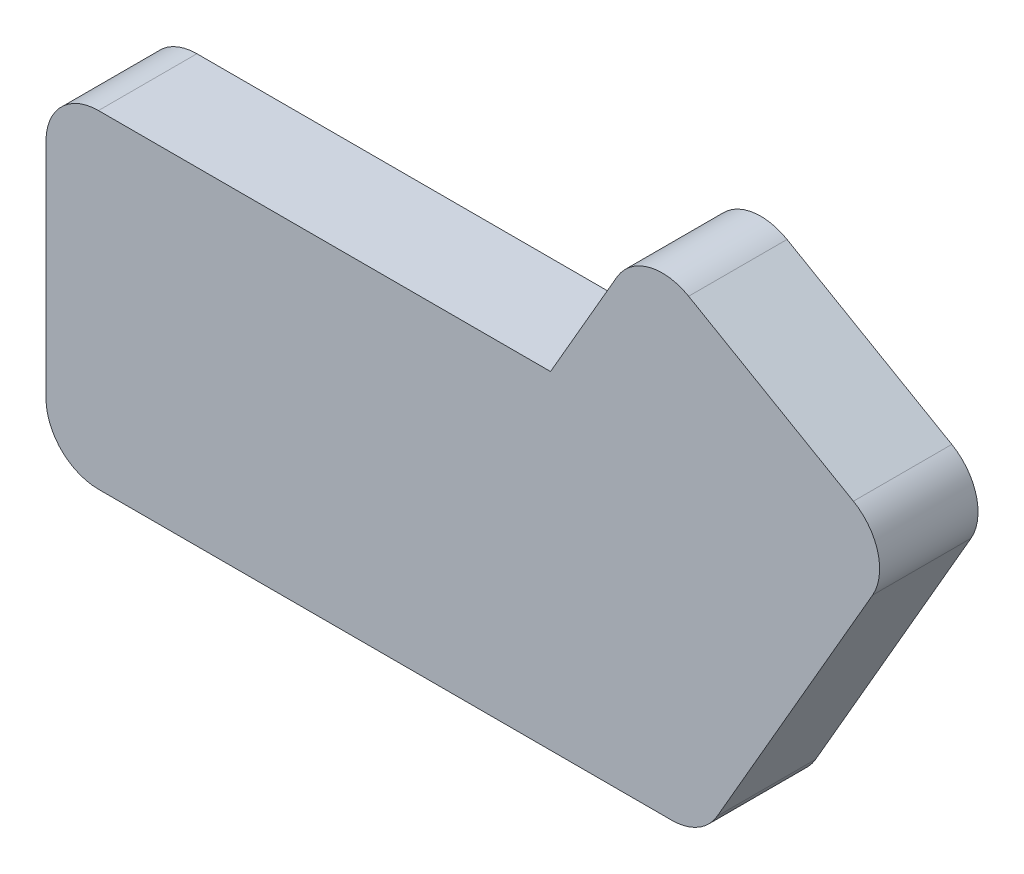
ISO-10303-21;
HEADER;
FILE_DESCRIPTION(('STEP AP214'),'2;1');
FILE_NAME('part.step','',(''),(''),'','','');
FILE_SCHEMA(('AUTOMOTIVE_DESIGN { 1 0 10303 214 1 1 1 1 }'));
ENDSEC;
DATA;
#1=APPLICATION_CONTEXT('core data for automotive mechanical design processes');
#2=APPLICATION_PROTOCOL_DEFINITION('international standard','automotive_design',2000,#1);
#3=PRODUCT_CONTEXT('',#1,'mechanical');
#4=PRODUCT('Part','Part','',(#3));
#5=PRODUCT_RELATED_PRODUCT_CATEGORY('part','',(#4));
#6=PRODUCT_DEFINITION_FORMATION('','',#4);
#7=PRODUCT_DEFINITION_CONTEXT('part definition',#1,'design');
#8=PRODUCT_DEFINITION('design','',#6,#7);
#9=PRODUCT_DEFINITION_SHAPE('','',#8);
#10=(LENGTH_UNIT() NAMED_UNIT(*) SI_UNIT(.MILLI.,.METRE.));
#11=(NAMED_UNIT(*) PLANE_ANGLE_UNIT() SI_UNIT($,.RADIAN.));
#12=(NAMED_UNIT(*) SI_UNIT($,.STERADIAN.) SOLID_ANGLE_UNIT());
#13=UNCERTAINTY_MEASURE_WITH_UNIT(LENGTH_MEASURE(1.E-05),#10,'distance_accuracy_value','');
#14=(GEOMETRIC_REPRESENTATION_CONTEXT(3) GLOBAL_UNCERTAINTY_ASSIGNED_CONTEXT((#13)) GLOBAL_UNIT_ASSIGNED_CONTEXT((#10,
#11,#12)) REPRESENTATION_CONTEXT('',''));
#15=CARTESIAN_POINT('',(0.,0.,0.));
#16=DIRECTION('',(0.,0.,1.));
#17=DIRECTION('',(1.,0.,0.));
#18=AXIS2_PLACEMENT_3D('',#15,#16,#17);
#19=CARTESIAN_POINT('',(76.9059892324149,50.,15.));
#20=DIRECTION('',(0.,-1.,0.));
#21=DIRECTION('',(1.,0.,0.));
#22=AXIS2_PLACEMENT_3D('',#19,#20,#21);
#23=PLANE('',#22);
#24=DIRECTION('',(-1.,0.,0.));
#25=VECTOR('',#24,1.);
#26=CARTESIAN_POINT('',(76.9059892324149,50.,0.));
#27=LINE('',#26,#25);
#28=CARTESIAN_POINT('',(76.9059892324149,50.,0.));
#29=VERTEX_POINT('',#28);
#30=CARTESIAN_POINT('',(8.00000000000006,50.,0.));
#31=VERTEX_POINT('',#30);
#32=EDGE_CURVE('E158',#29,#31,#27,.T.);
#33=ORIENTED_EDGE('',*,*,#32,.T.);
#34=DIRECTION('',(0.,0.,-1.));
#35=VECTOR('',#34,1.);
#36=CARTESIAN_POINT('',(8.00000000000006,50.,15.));
#37=LINE('',#36,#35);
#38=CARTESIAN_POINT('',(8.00000000000006,50.,15.));
#39=VERTEX_POINT('',#38);
#40=EDGE_CURVE('E11',#39,#31,#37,.T.);
#41=ORIENTED_EDGE('',*,*,#40,.F.);
#42=DIRECTION('',(-1.,0.,0.));
#43=VECTOR('',#42,1.);
#44=CARTESIAN_POINT('',(76.9059892324149,50.,15.));
#45=LINE('',#44,#43);
#46=CARTESIAN_POINT('',(76.9059892324149,50.,15.));
#47=VERTEX_POINT('',#46);
#48=EDGE_CURVE('E189',#47,#39,#45,.T.);
#49=ORIENTED_EDGE('',*,*,#48,.F.);
#50=DIRECTION('',(0.,0.,-1.));
#51=VECTOR('',#50,1.);
#52=CARTESIAN_POINT('',(76.9059892324149,50.,15.));
#53=LINE('',#52,#51);
#54=EDGE_CURVE('E154',#47,#29,#53,.T.);
#55=ORIENTED_EDGE('',*,*,#54,.T.);
#56=EDGE_LOOP('',(#33,#41,#49,#55));
#57=FACE_BOUND('',#56,.T.);
#58=ADVANCED_FACE('F39',(#57),#23,.F.);
#59=CARTESIAN_POINT('',(8.,42.,15.));
#60=DIRECTION('',(0.,0.,-1.));
#61=DIRECTION('',(-1.,0.,0.));
#62=AXIS2_PLACEMENT_3D('',#59,#60,#61);
#63=CYLINDRICAL_SURFACE('',#62,8.);
#64=CARTESIAN_POINT('',(8.,42.,0.));
#65=DIRECTION('',(0.,0.,1.));
#66=DIRECTION('',(1.,0.,0.));
#67=AXIS2_PLACEMENT_3D('',#64,#65,#66);
#68=CIRCLE('',#67,8.);
#69=CARTESIAN_POINT('',(0.,42.,0.));
#70=VERTEX_POINT('',#69);
#71=EDGE_CURVE('E162',#31,#70,#68,.T.);
#72=ORIENTED_EDGE('',*,*,#71,.T.);
#73=DIRECTION('',(0.,0.,-1.));
#74=VECTOR('',#73,1.);
#75=CARTESIAN_POINT('',(0.,42.,15.));
#76=LINE('',#75,#74);
#77=CARTESIAN_POINT('',(0.,42.,15.));
#78=VERTEX_POINT('',#77);
#79=EDGE_CURVE('E48',#78,#70,#76,.T.);
#80=ORIENTED_EDGE('',*,*,#79,.F.);
#81=CARTESIAN_POINT('',(8.,42.,15.));
#82=DIRECTION('',(0.,0.,1.));
#83=DIRECTION('',(1.,0.,0.));
#84=AXIS2_PLACEMENT_3D('',#81,#82,#83);
#85=CIRCLE('',#84,8.);
#86=EDGE_CURVE('E108',#39,#78,#85,.T.);
#87=ORIENTED_EDGE('',*,*,#86,.F.);
#88=ORIENTED_EDGE('',*,*,#40,.T.);
#89=EDGE_LOOP('',(#72,#80,#87,#88));
#90=FACE_BOUND('',#89,.T.);
#91=ADVANCED_FACE('F275',(#90),#63,.T.);
#92=CARTESIAN_POINT('',(0.,42.,15.));
#93=DIRECTION('',(1.,0.,0.));
#94=DIRECTION('',(0.,1.,0.));
#95=AXIS2_PLACEMENT_3D('',#92,#93,#94);
#96=PLANE('',#95);
#97=DIRECTION('',(0.,-1.,0.));
#98=VECTOR('',#97,1.);
#99=CARTESIAN_POINT('',(0.,42.,0.));
#100=LINE('',#99,#98);
#101=CARTESIAN_POINT('',(0.,8.00000000000006,0.));
#102=VERTEX_POINT('',#101);
#103=EDGE_CURVE('E165',#70,#102,#100,.T.);
#104=ORIENTED_EDGE('',*,*,#103,.T.);
#105=DIRECTION('',(0.,0.,-1.));
#106=VECTOR('',#105,1.);
#107=CARTESIAN_POINT('',(0.,8.00000000000006,15.));
#108=LINE('',#107,#106);
#109=CARTESIAN_POINT('',(0.,8.00000000000006,15.));
#110=VERTEX_POINT('',#109);
#111=EDGE_CURVE('E212',#110,#102,#108,.T.);
#112=ORIENTED_EDGE('',*,*,#111,.F.);
#113=DIRECTION('',(0.,-1.,0.));
#114=VECTOR('',#113,1.);
#115=CARTESIAN_POINT('',(0.,42.,15.));
#116=LINE('',#115,#114);
#117=EDGE_CURVE('E222',#78,#110,#116,.T.);
#118=ORIENTED_EDGE('',*,*,#117,.F.);
#119=ORIENTED_EDGE('',*,*,#79,.T.);
#120=EDGE_LOOP('',(#104,#112,#118,#119));
#121=FACE_BOUND('',#120,.T.);
#122=ADVANCED_FACE('F220',(#121),#96,.F.);
#123=CARTESIAN_POINT('',(8.,8.,15.));
#124=DIRECTION('',(0.,0.,-1.));
#125=DIRECTION('',(-1.,0.,0.));
#126=AXIS2_PLACEMENT_3D('',#123,#124,#125);
#127=CYLINDRICAL_SURFACE('',#126,8.);
#128=CARTESIAN_POINT('',(8.,8.,0.));
#129=DIRECTION('',(0.,0.,1.));
#130=DIRECTION('',(1.,0.,0.));
#131=AXIS2_PLACEMENT_3D('',#128,#129,#130);
#132=CIRCLE('',#131,8.);
#133=CARTESIAN_POINT('',(8.00000000000006,0.,0.));
#134=VERTEX_POINT('',#133);
#135=EDGE_CURVE('E168',#102,#134,#132,.T.);
#136=ORIENTED_EDGE('',*,*,#135,.T.);
#137=DIRECTION('',(0.,0.,-1.));
#138=VECTOR('',#137,1.);
#139=CARTESIAN_POINT('',(8.00000000000006,0.,15.));
#140=LINE('',#139,#138);
#141=CARTESIAN_POINT('',(8.00000000000006,0.,15.));
#142=VERTEX_POINT('',#141);
#143=EDGE_CURVE('E208',#142,#134,#140,.T.);
#144=ORIENTED_EDGE('',*,*,#143,.F.);
#145=CARTESIAN_POINT('',(8.,8.,15.));
#146=DIRECTION('',(0.,0.,1.));
#147=DIRECTION('',(1.,0.,0.));
#148=AXIS2_PLACEMENT_3D('',#145,#146,#147);
#149=CIRCLE('',#148,8.);
#150=EDGE_CURVE('E241',#110,#142,#149,.T.);
#151=ORIENTED_EDGE('',*,*,#150,.F.);
#152=ORIENTED_EDGE('',*,*,#111,.T.);
#153=EDGE_LOOP('',(#136,#144,#151,#152));
#154=FACE_BOUND('',#153,.T.);
#155=ADVANCED_FACE('F231',(#154),#127,.T.);
#156=CARTESIAN_POINT('',(8.00000000000006,0.,15.));
#157=DIRECTION('',(0.,1.,0.));
#158=DIRECTION('',(0.,0.,1.));
#159=AXIS2_PLACEMENT_3D('',#156,#157,#158);
#160=PLANE('',#159);
#161=DIRECTION('',(1.,0.,0.));
#162=VECTOR('',#161,1.);
#163=CARTESIAN_POINT('',(8.00000000000006,0.,0.));
#164=LINE('',#163,#162);
#165=CARTESIAN_POINT('',(95.381197846483,0.,0.));
#166=VERTEX_POINT('',#165);
#167=EDGE_CURVE('E171',#134,#166,#164,.T.);
#168=ORIENTED_EDGE('',*,*,#167,.T.);
#169=DIRECTION('',(0.,0.,-1.));
#170=VECTOR('',#169,1.);
#171=CARTESIAN_POINT('',(95.381197846483,0.,15.));
#172=LINE('',#171,#170);
#173=CARTESIAN_POINT('',(95.381197846483,0.,15.));
#174=VERTEX_POINT('',#173);
#175=EDGE_CURVE('E204',#174,#166,#172,.T.);
#176=ORIENTED_EDGE('',*,*,#175,.F.);
#177=DIRECTION('',(1.,0.,0.));
#178=VECTOR('',#177,1.);
#179=CARTESIAN_POINT('',(8.00000000000006,0.,15.));
#180=LINE('',#179,#178);
#181=EDGE_CURVE('E237',#142,#174,#180,.T.);
#182=ORIENTED_EDGE('',*,*,#181,.F.);
#183=ORIENTED_EDGE('',*,*,#143,.T.);
#184=EDGE_LOOP('',(#168,#176,#182,#183));
#185=FACE_BOUND('',#184,.T.);
#186=ADVANCED_FACE('F235',(#185),#160,.F.);
#187=CARTESIAN_POINT('',(95.381197846483,8.,15.));
#188=DIRECTION('',(0.,0.,-1.));
#189=DIRECTION('',(-1.,0.,0.));
#190=AXIS2_PLACEMENT_3D('',#187,#188,#189);
#191=CYLINDRICAL_SURFACE('',#190,8.00000000000001);
#192=CARTESIAN_POINT('',(95.381197846483,8.,0.));
#193=DIRECTION('',(0.,0.,1.));
#194=DIRECTION('',(1.,0.,0.));
#195=AXIS2_PLACEMENT_3D('',#192,#193,#194);
#196=CIRCLE('',#195,8.00000000000001);
#197=CARTESIAN_POINT('',(102.309401076759,4.00000000000001,0.));
#198=VERTEX_POINT('',#197);
#199=EDGE_CURVE('E174',#166,#198,#196,.T.);
#200=ORIENTED_EDGE('',*,*,#199,.T.);
#201=DIRECTION('',(0.,0.,-1.));
#202=VECTOR('',#201,1.);
#203=CARTESIAN_POINT('',(102.309401076759,4.00000000000001,15.));
#204=LINE('',#203,#202);
#205=CARTESIAN_POINT('',(102.309401076759,4.00000000000001,15.));
#206=VERTEX_POINT('',#205);
#207=EDGE_CURVE('E200',#206,#198,#204,.T.);
#208=ORIENTED_EDGE('',*,*,#207,.F.);
#209=CARTESIAN_POINT('',(95.381197846483,8.,15.));
#210=DIRECTION('',(0.,0.,1.));
#211=DIRECTION('',(1.,0.,0.));
#212=AXIS2_PLACEMENT_3D('',#209,#210,#211);
#213=CIRCLE('',#212,8.00000000000001);
#214=EDGE_CURVE('E240',#174,#206,#213,.T.);
#215=ORIENTED_EDGE('',*,*,#214,.F.);
#216=ORIENTED_EDGE('',*,*,#175,.T.);
#217=EDGE_LOOP('',(#200,#208,#215,#216));
#218=FACE_BOUND('',#217,.T.);
#219=ADVANCED_FACE('F288',(#218),#191,.T.);
#220=CARTESIAN_POINT('',(102.309401076759,4.00000000000001,15.));
#221=DIRECTION('',(-0.86602540378444,0.499999999999998,0.));
#222=DIRECTION('',(-0.499999999999998,-0.86602540378444,0.));
#223=AXIS2_PLACEMENT_3D('',#220,#221,#222);
#224=PLANE('',#223);
#225=DIRECTION('',(0.499999999999998,0.86602540378444,0.));
#226=VECTOR('',#225,1.);
#227=CARTESIAN_POINT('',(102.309401076759,4.00000000000001,0.));
#228=LINE('',#227,#226);
#229=CARTESIAN_POINT('',(126.,45.0333209967911,0.));
#230=VERTEX_POINT('',#229);
#231=EDGE_CURVE('E177',#198,#230,#228,.T.);
#232=ORIENTED_EDGE('',*,*,#231,.T.);
#233=DIRECTION('',(0.,0.,-1.));
#234=VECTOR('',#233,1.);
#235=CARTESIAN_POINT('',(126.,45.0333209967911,15.));
#236=LINE('',#235,#234);
#237=CARTESIAN_POINT('',(126.,45.0333209967911,15.));
#238=VERTEX_POINT('',#237);
#239=EDGE_CURVE('E196',#238,#230,#236,.T.);
#240=ORIENTED_EDGE('',*,*,#239,.F.);
#241=DIRECTION('',(0.499999999999998,0.86602540378444,0.));
#242=VECTOR('',#241,1.);
#243=CARTESIAN_POINT('',(102.309401076759,4.00000000000001,15.));
#244=LINE('',#243,#242);
#245=EDGE_CURVE('E245',#206,#238,#244,.T.);
#246=ORIENTED_EDGE('',*,*,#245,.F.);
#247=ORIENTED_EDGE('',*,*,#207,.T.);
#248=EDGE_LOOP('',(#232,#240,#246,#247));
#249=FACE_BOUND('',#248,.T.);
#250=ADVANCED_FACE('F256',(#249),#224,.F.);
#251=CARTESIAN_POINT('',(119.071796769725,49.0333209967911,15.));
#252=DIRECTION('',(0.,0.,-1.));
#253=DIRECTION('',(-1.,0.,0.));
#254=AXIS2_PLACEMENT_3D('',#251,#252,#253);
#255=CYLINDRICAL_SURFACE('',#254,8.00000000000001);
#256=CARTESIAN_POINT('',(119.071796769725,49.0333209967911,0.));
#257=DIRECTION('',(0.,0.,1.));
#258=DIRECTION('',(1.,0.,0.));
#259=AXIS2_PLACEMENT_3D('',#256,#257,#258);
#260=CIRCLE('',#259,8.00000000000001);
#261=CARTESIAN_POINT('',(123.071796769724,55.9615242270666,0.));
#262=VERTEX_POINT('',#261);
#263=EDGE_CURVE('E180',#230,#262,#260,.T.);
#264=ORIENTED_EDGE('',*,*,#263,.T.);
#265=DIRECTION('',(0.,0.,-1.));
#266=VECTOR('',#265,1.);
#267=CARTESIAN_POINT('',(123.071796769724,55.9615242270666,15.));
#268=LINE('',#267,#266);
#269=CARTESIAN_POINT('',(123.071796769724,55.9615242270666,15.));
#270=VERTEX_POINT('',#269);
#271=EDGE_CURVE('E147',#270,#262,#268,.T.);
#272=ORIENTED_EDGE('',*,*,#271,.F.);
#273=CARTESIAN_POINT('',(119.071796769725,49.0333209967911,15.));
#274=DIRECTION('',(0.,0.,1.));
#275=DIRECTION('',(1.,0.,0.));
#276=AXIS2_PLACEMENT_3D('',#273,#274,#275);
#277=CIRCLE('',#276,8.00000000000001);
#278=EDGE_CURVE('E136',#238,#270,#277,.T.);
#279=ORIENTED_EDGE('',*,*,#278,.F.);
#280=ORIENTED_EDGE('',*,*,#239,.T.);
#281=EDGE_LOOP('',(#264,#272,#279,#280));
#282=FACE_BOUND('',#281,.T.);
#283=ADVANCED_FACE('F260',(#282),#255,.T.);
#284=CARTESIAN_POINT('',(123.071796769724,55.9615242270666,15.));
#285=DIRECTION('',(-0.499999999999997,-0.86602540378444,0.));
#286=DIRECTION('',(0.86602540378444,-0.499999999999997,0.));
#287=AXIS2_PLACEMENT_3D('',#284,#285,#286);
#288=PLANE('',#287);
#289=DIRECTION('',(-0.86602540378444,0.499999999999997,0.));
#290=VECTOR('',#289,1.);
#291=CARTESIAN_POINT('',(123.071796769724,55.9615242270666,0.));
#292=LINE('',#291,#290);
#293=CARTESIAN_POINT('',(97.9570600599757,70.4615242270665,0.));
#294=VERTEX_POINT('',#293);
#295=EDGE_CURVE('E145',#262,#294,#292,.T.);
#296=ORIENTED_EDGE('',*,*,#295,.T.);
#297=DIRECTION('',(0.,0.,-1.));
#298=VECTOR('',#297,1.);
#299=CARTESIAN_POINT('',(97.9570600599757,70.4615242270665,15.));
#300=LINE('',#299,#298);
#301=CARTESIAN_POINT('',(97.9570600599757,70.4615242270665,15.));
#302=VERTEX_POINT('',#301);
#303=EDGE_CURVE('E142',#302,#294,#300,.T.);
#304=ORIENTED_EDGE('',*,*,#303,.F.);
#305=DIRECTION('',(-0.86602540378444,0.499999999999997,0.));
#306=VECTOR('',#305,1.);
#307=CARTESIAN_POINT('',(123.071796769724,55.9615242270666,15.));
#308=LINE('',#307,#306);
#309=EDGE_CURVE('E130',#270,#302,#308,.T.);
#310=ORIENTED_EDGE('',*,*,#309,.F.);
#311=ORIENTED_EDGE('',*,*,#271,.T.);
#312=EDGE_LOOP('',(#296,#304,#310,#311));
#313=FACE_BOUND('',#312,.T.);
#314=ADVANCED_FACE('F143',(#313),#288,.F.);
#315=CARTESIAN_POINT('',(93.9570600599757,63.533320996791,15.));
#316=DIRECTION('',(0.,0.,-1.));
#317=DIRECTION('',(-1.,0.,0.));
#318=AXIS2_PLACEMENT_3D('',#315,#316,#317);
#319=CYLINDRICAL_SURFACE('',#318,8.00000000000003);
#320=CARTESIAN_POINT('',(93.9570600599757,63.533320996791,0.));
#321=DIRECTION('',(0.,0.,1.));
#322=DIRECTION('',(1.,0.,0.));
#323=AXIS2_PLACEMENT_3D('',#320,#321,#322);
#324=CIRCLE('',#323,8.00000000000003);
#325=CARTESIAN_POINT('',(87.0288568297002,67.533320996791,0.));
#326=VERTEX_POINT('',#325);
#327=EDGE_CURVE('E94',#294,#326,#324,.T.);
#328=ORIENTED_EDGE('',*,*,#327,.T.);
#329=DIRECTION('',(0.,0.,-1.));
#330=VECTOR('',#329,1.);
#331=CARTESIAN_POINT('',(87.0288568297002,67.533320996791,15.));
#332=LINE('',#331,#330);
#333=CARTESIAN_POINT('',(87.0288568297002,67.533320996791,15.));
#334=VERTEX_POINT('',#333);
#335=EDGE_CURVE('E148',#334,#326,#332,.T.);
#336=ORIENTED_EDGE('',*,*,#335,.F.);
#337=CARTESIAN_POINT('',(93.9570600599757,63.533320996791,15.));
#338=DIRECTION('',(0.,0.,1.));
#339=DIRECTION('',(1.,0.,0.));
#340=AXIS2_PLACEMENT_3D('',#337,#338,#339);
#341=CIRCLE('',#340,8.00000000000003);
#342=EDGE_CURVE('E134',#302,#334,#341,.T.);
#343=ORIENTED_EDGE('',*,*,#342,.F.);
#344=ORIENTED_EDGE('',*,*,#303,.T.);
#345=EDGE_LOOP('',(#328,#336,#343,#344));
#346=FACE_BOUND('',#345,.T.);
#347=ADVANCED_FACE('F150',(#346),#319,.T.);
#348=CARTESIAN_POINT('',(87.0288568297002,67.533320996791,15.));
#349=DIRECTION('',(0.86602540378444,-0.499999999999997,0.));
#350=DIRECTION('',(0.499999999999997,0.866025403784441,0.));
#351=AXIS2_PLACEMENT_3D('',#348,#349,#350);
#352=PLANE('',#351);
#353=DIRECTION('',(-0.499999999999997,-0.866025403784441,0.));
#354=VECTOR('',#353,1.);
#355=CARTESIAN_POINT('',(87.0288568297002,67.533320996791,0.));
#356=LINE('',#355,#354);
#357=EDGE_CURVE('E100',#326,#29,#356,.T.);
#358=ORIENTED_EDGE('',*,*,#357,.T.);
#359=ORIENTED_EDGE('',*,*,#54,.F.);
#360=DIRECTION('',(-0.499999999999997,-0.866025403784441,0.));
#361=VECTOR('',#360,1.);
#362=CARTESIAN_POINT('',(87.0288568297002,67.533320996791,15.));
#363=LINE('',#362,#361);
#364=EDGE_CURVE('E56',#334,#47,#363,.T.);
#365=ORIENTED_EDGE('',*,*,#364,.F.);
#366=ORIENTED_EDGE('',*,*,#335,.T.);
#367=EDGE_LOOP('',(#358,#359,#365,#366));
#368=FACE_BOUND('',#367,.T.);
#369=ADVANCED_FACE('F264',(#368),#352,.F.);
#370=CARTESIAN_POINT('',(8.,42.,15.));
#371=DIRECTION('',(0.,0.,1.));
#372=DIRECTION('',(1.,0.,0.));
#373=AXIS2_PLACEMENT_3D('',#370,#371,#372);
#374=PLANE('',#373);
#375=ORIENTED_EDGE('',*,*,#48,.T.);
#376=ORIENTED_EDGE('',*,*,#86,.T.);
#377=ORIENTED_EDGE('',*,*,#117,.T.);
#378=ORIENTED_EDGE('',*,*,#150,.T.);
#379=ORIENTED_EDGE('',*,*,#181,.T.);
#380=ORIENTED_EDGE('',*,*,#214,.T.);
#381=ORIENTED_EDGE('',*,*,#245,.T.);
#382=ORIENTED_EDGE('',*,*,#278,.T.);
#383=ORIENTED_EDGE('',*,*,#309,.T.);
#384=ORIENTED_EDGE('',*,*,#342,.T.);
#385=ORIENTED_EDGE('',*,*,#364,.T.);
#386=EDGE_LOOP('',(#375,#376,#377,#378,#379,#380,#381,#382,#383,#384,#385));
#387=FACE_BOUND('',#386,.T.);
#388=ADVANCED_FACE('F132',(#387),#374,.T.);
#389=CARTESIAN_POINT('',(8.,42.,0.));
#390=DIRECTION('',(0.,0.,1.));
#391=DIRECTION('',(1.,0.,0.));
#392=AXIS2_PLACEMENT_3D('',#389,#390,#391);
#393=PLANE('',#392);
#394=ORIENTED_EDGE('',*,*,#32,.F.);
#395=ORIENTED_EDGE('',*,*,#357,.F.);
#396=ORIENTED_EDGE('',*,*,#327,.F.);
#397=ORIENTED_EDGE('',*,*,#295,.F.);
#398=ORIENTED_EDGE('',*,*,#263,.F.);
#399=ORIENTED_EDGE('',*,*,#231,.F.);
#400=ORIENTED_EDGE('',*,*,#199,.F.);
#401=ORIENTED_EDGE('',*,*,#167,.F.);
#402=ORIENTED_EDGE('',*,*,#135,.F.);
#403=ORIENTED_EDGE('',*,*,#103,.F.);
#404=ORIENTED_EDGE('',*,*,#71,.F.);
#405=EDGE_LOOP('',(#394,#395,#396,#397,#398,#399,#400,#401,#402,#403,#404));
#406=FACE_BOUND('',#405,.T.);
#407=ADVANCED_FACE('F226',(#406),#393,.F.);
#408=CLOSED_SHELL('',(#58,#91,#122,#155,#186,#219,#250,#283,#314,#347,#369,#388,#407));
#409=MANIFOLD_SOLID_BREP('B2',#408);
#410=ADVANCED_BREP_SHAPE_REPRESENTATION('',(#18,#409),#14);
#411=SHAPE_DEFINITION_REPRESENTATION(#9,#410);
ENDSEC;
END-ISO-10303-21;
